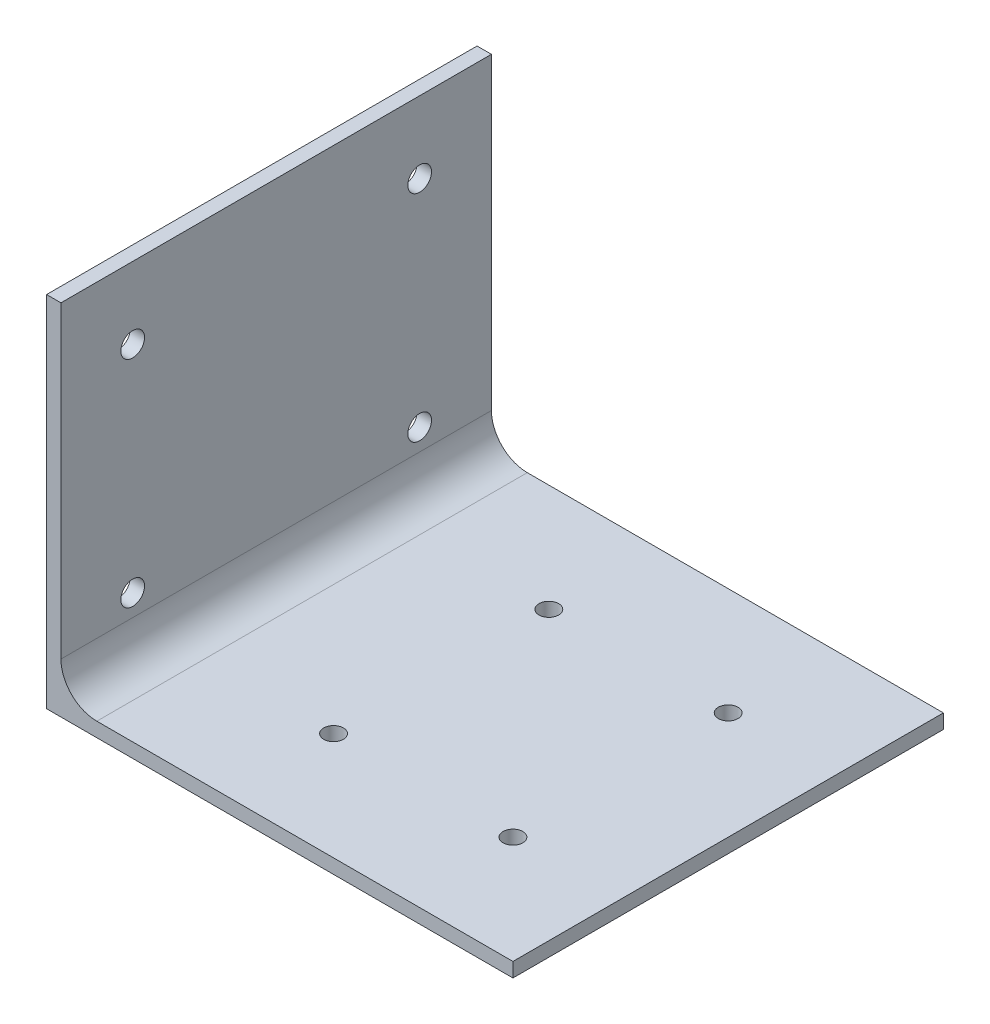
ISO-10303-21;
HEADER;
FILE_DESCRIPTION(('STEP AP214'),'2;1');
FILE_NAME('part.step','',(''),(''),'','','');
FILE_SCHEMA(('AUTOMOTIVE_DESIGN { 1 0 10303 214 1 1 1 1 }'));
ENDSEC;
DATA;
#1=APPLICATION_CONTEXT('core data for automotive mechanical design processes');
#2=APPLICATION_PROTOCOL_DEFINITION('international standard','automotive_design',2000,#1);
#3=PRODUCT_CONTEXT('',#1,'mechanical');
#4=PRODUCT('Part','Part','',(#3));
#5=PRODUCT_RELATED_PRODUCT_CATEGORY('part','',(#4));
#6=PRODUCT_DEFINITION_FORMATION('','',#4);
#7=PRODUCT_DEFINITION_CONTEXT('part definition',#1,'design');
#8=PRODUCT_DEFINITION('design','',#6,#7);
#9=PRODUCT_DEFINITION_SHAPE('','',#8);
#10=(LENGTH_UNIT() NAMED_UNIT(*) SI_UNIT(.MILLI.,.METRE.));
#11=(NAMED_UNIT(*) PLANE_ANGLE_UNIT() SI_UNIT($,.RADIAN.));
#12=(NAMED_UNIT(*) SI_UNIT($,.STERADIAN.) SOLID_ANGLE_UNIT());
#13=UNCERTAINTY_MEASURE_WITH_UNIT(LENGTH_MEASURE(1.E-05),#10,'distance_accuracy_value','');
#14=(GEOMETRIC_REPRESENTATION_CONTEXT(3) GLOBAL_UNCERTAINTY_ASSIGNED_CONTEXT((#13)) GLOBAL_UNIT_ASSIGNED_CONTEXT((#10,
#11,#12)) REPRESENTATION_CONTEXT('',''));
#15=CARTESIAN_POINT('',(0.,0.,0.));
#16=DIRECTION('',(0.,0.,1.));
#17=DIRECTION('',(1.,0.,0.));
#18=AXIS2_PLACEMENT_3D('',#15,#16,#17);
#19=CARTESIAN_POINT('',(130.,0.,120.));
#20=DIRECTION('',(0.,1.,0.));
#21=DIRECTION('',(-1.,0.,0.));
#22=AXIS2_PLACEMENT_3D('',#19,#20,#21);
#23=PLANE('',#22);
#24=CARTESIAN_POINT('',(100.,0.,90.));
#25=DIRECTION('',(0.,1.,0.));
#26=DIRECTION('',(-1.,0.,0.));
#27=AXIS2_PLACEMENT_3D('',#24,#25,#26);
#28=CIRCLE('',#27,2.75000000000001);
#29=CARTESIAN_POINT('',(97.25,0.,90.));
#30=VERTEX_POINT('',#29);
#31=EDGE_CURVE('E181',#30,#30,#28,.T.);
#32=ORIENTED_EDGE('',*,*,#31,.T.);
#33=EDGE_LOOP('',(#32));
#34=FACE_BOUND('',#33,.T.);
#35=CARTESIAN_POINT('',(50.,0.,90.));
#36=DIRECTION('',(0.,1.,0.));
#37=DIRECTION('',(-1.,0.,0.));
#38=AXIS2_PLACEMENT_3D('',#35,#36,#37);
#39=CIRCLE('',#38,2.75);
#40=CARTESIAN_POINT('',(47.25,0.,90.));
#41=VERTEX_POINT('',#40);
#42=EDGE_CURVE('E190',#41,#41,#39,.T.);
#43=ORIENTED_EDGE('',*,*,#42,.T.);
#44=EDGE_LOOP('',(#43));
#45=FACE_BOUND('',#44,.T.);
#46=CARTESIAN_POINT('',(50.,0.,30.));
#47=DIRECTION('',(0.,1.,0.));
#48=DIRECTION('',(-1.,0.,0.));
#49=AXIS2_PLACEMENT_3D('',#46,#47,#48);
#50=CIRCLE('',#49,2.75);
#51=CARTESIAN_POINT('',(47.25,0.,30.));
#52=VERTEX_POINT('',#51);
#53=EDGE_CURVE('E193',#52,#52,#50,.T.);
#54=ORIENTED_EDGE('',*,*,#53,.T.);
#55=EDGE_LOOP('',(#54));
#56=FACE_BOUND('',#55,.T.);
#57=CARTESIAN_POINT('',(100.,0.,30.));
#58=DIRECTION('',(0.,1.,0.));
#59=DIRECTION('',(-1.,0.,0.));
#60=AXIS2_PLACEMENT_3D('',#57,#58,#59);
#61=CIRCLE('',#60,2.75000000000001);
#62=CARTESIAN_POINT('',(97.25,0.,30.));
#63=VERTEX_POINT('',#62);
#64=EDGE_CURVE('E162',#63,#63,#61,.T.);
#65=ORIENTED_EDGE('',*,*,#64,.T.);
#66=EDGE_LOOP('',(#65));
#67=FACE_BOUND('',#66,.T.);
#68=DIRECTION('',(1.,0.,0.));
#69=VECTOR('',#68,1.);
#70=CARTESIAN_POINT('',(130.,0.,0.));
#71=LINE('',#70,#69);
#72=CARTESIAN_POINT('',(0.,0.,0.));
#73=VERTEX_POINT('',#72);
#74=CARTESIAN_POINT('',(130.,0.,0.));
#75=VERTEX_POINT('',#74);
#76=EDGE_CURVE('E116',#73,#75,#71,.T.);
#77=ORIENTED_EDGE('',*,*,#76,.T.);
#78=DIRECTION('',(0.,0.,-1.));
#79=VECTOR('',#78,1.);
#80=CARTESIAN_POINT('',(130.,0.,120.));
#81=LINE('',#80,#79);
#82=CARTESIAN_POINT('',(130.,0.,120.));
#83=VERTEX_POINT('',#82);
#84=EDGE_CURVE('E105',#83,#75,#81,.T.);
#85=ORIENTED_EDGE('',*,*,#84,.F.);
#86=DIRECTION('',(1.,0.,0.));
#87=VECTOR('',#86,1.);
#88=CARTESIAN_POINT('',(130.,0.,120.));
#89=LINE('',#88,#87);
#90=CARTESIAN_POINT('',(0.,0.,120.));
#91=VERTEX_POINT('',#90);
#92=EDGE_CURVE('E107',#91,#83,#89,.T.);
#93=ORIENTED_EDGE('',*,*,#92,.F.);
#94=DIRECTION('',(0.,0.,-1.));
#95=VECTOR('',#94,1.);
#96=CARTESIAN_POINT('',(0.,0.,120.));
#97=LINE('',#96,#95);
#98=EDGE_CURVE('E135',#91,#73,#97,.T.);
#99=ORIENTED_EDGE('',*,*,#98,.T.);
#100=EDGE_LOOP('',(#77,#85,#93,#99));
#101=FACE_BOUND('',#100,.T.);
#102=ADVANCED_FACE('F39',(#34,#45,#56,#67,#101),#23,.F.);
#103=CARTESIAN_POINT('',(130.,4.,120.));
#104=DIRECTION('',(-1.,0.,0.));
#105=DIRECTION('',(0.,0.,1.));
#106=AXIS2_PLACEMENT_3D('',#103,#104,#105);
#107=PLANE('',#106);
#108=DIRECTION('',(0.,1.,0.));
#109=VECTOR('',#108,1.);
#110=CARTESIAN_POINT('',(130.,4.,0.));
#111=LINE('',#110,#109);
#112=CARTESIAN_POINT('',(130.,4.,0.));
#113=VERTEX_POINT('',#112);
#114=EDGE_CURVE('E141',#75,#113,#111,.T.);
#115=ORIENTED_EDGE('',*,*,#114,.T.);
#116=DIRECTION('',(0.,0.,-1.));
#117=VECTOR('',#116,1.);
#118=CARTESIAN_POINT('',(130.,4.,120.));
#119=LINE('',#118,#117);
#120=CARTESIAN_POINT('',(130.,4.,120.));
#121=VERTEX_POINT('',#120);
#122=EDGE_CURVE('E104',#121,#113,#119,.T.);
#123=ORIENTED_EDGE('',*,*,#122,.F.);
#124=DIRECTION('',(0.,1.,0.));
#125=VECTOR('',#124,1.);
#126=CARTESIAN_POINT('',(130.,4.,120.));
#127=LINE('',#126,#125);
#128=EDGE_CURVE('E98',#83,#121,#127,.T.);
#129=ORIENTED_EDGE('',*,*,#128,.F.);
#130=ORIENTED_EDGE('',*,*,#84,.T.);
#131=EDGE_LOOP('',(#115,#123,#129,#130));
#132=FACE_BOUND('',#131,.T.);
#133=ADVANCED_FACE('F99',(#132),#107,.F.);
#134=CARTESIAN_POINT('',(4.00000000000001,4.,120.));
#135=DIRECTION('',(0.,-1.,0.));
#136=DIRECTION('',(1.,0.,0.));
#137=AXIS2_PLACEMENT_3D('',#134,#135,#136);
#138=PLANE('',#137);
#139=CARTESIAN_POINT('',(100.,4.,90.));
#140=DIRECTION('',(0.,1.,0.));
#141=DIRECTION('',(-1.,0.,0.));
#142=AXIS2_PLACEMENT_3D('',#139,#140,#141);
#143=CIRCLE('',#142,2.75000000000001);
#144=CARTESIAN_POINT('',(97.25,4.,90.));
#145=VERTEX_POINT('',#144);
#146=EDGE_CURVE('E188',#145,#145,#143,.T.);
#147=ORIENTED_EDGE('',*,*,#146,.F.);
#148=EDGE_LOOP('',(#147));
#149=FACE_BOUND('',#148,.T.);
#150=CARTESIAN_POINT('',(50.,4.,90.));
#151=DIRECTION('',(0.,1.,0.));
#152=DIRECTION('',(-1.,0.,0.));
#153=AXIS2_PLACEMENT_3D('',#150,#151,#152);
#154=CIRCLE('',#153,2.75);
#155=CARTESIAN_POINT('',(47.25,4.,90.));
#156=VERTEX_POINT('',#155);
#157=EDGE_CURVE('E194',#156,#156,#154,.T.);
#158=ORIENTED_EDGE('',*,*,#157,.F.);
#159=EDGE_LOOP('',(#158));
#160=FACE_BOUND('',#159,.T.);
#161=CARTESIAN_POINT('',(50.,4.,30.));
#162=DIRECTION('',(0.,1.,0.));
#163=DIRECTION('',(-1.,0.,0.));
#164=AXIS2_PLACEMENT_3D('',#161,#162,#163);
#165=CIRCLE('',#164,2.75);
#166=CARTESIAN_POINT('',(47.25,4.,30.));
#167=VERTEX_POINT('',#166);
#168=EDGE_CURVE('E178',#167,#167,#165,.T.);
#169=ORIENTED_EDGE('',*,*,#168,.F.);
#170=EDGE_LOOP('',(#169));
#171=FACE_BOUND('',#170,.T.);
#172=CARTESIAN_POINT('',(100.,4.,30.));
#173=DIRECTION('',(0.,1.,0.));
#174=DIRECTION('',(-1.,0.,0.));
#175=AXIS2_PLACEMENT_3D('',#172,#173,#174);
#176=CIRCLE('',#175,2.75000000000001);
#177=CARTESIAN_POINT('',(97.25,4.,30.));
#178=VERTEX_POINT('',#177);
#179=EDGE_CURVE('E179',#178,#178,#176,.T.);
#180=ORIENTED_EDGE('',*,*,#179,.F.);
#181=EDGE_LOOP('',(#180));
#182=FACE_BOUND('',#181,.T.);
#183=DIRECTION('',(-1.,0.,0.));
#184=VECTOR('',#183,1.);
#185=CARTESIAN_POINT('',(4.00000000000001,4.,0.));
#186=LINE('',#185,#184);
#187=CARTESIAN_POINT('',(14.,4.,0.));
#188=VERTEX_POINT('',#187);
#189=EDGE_CURVE('E143',#113,#188,#186,.T.);
#190=ORIENTED_EDGE('',*,*,#189,.T.);
#191=DIRECTION('',(0.,0.,-1.));
#192=VECTOR('',#191,1.);
#193=CARTESIAN_POINT('',(14.,4.,120.));
#194=LINE('',#193,#192);
#195=CARTESIAN_POINT('',(14.,4.,120.));
#196=VERTEX_POINT('',#195);
#197=EDGE_CURVE('E53',#188,#196,#194,.F.);
#198=ORIENTED_EDGE('',*,*,#197,.T.);
#199=DIRECTION('',(-1.,0.,0.));
#200=VECTOR('',#199,1.);
#201=CARTESIAN_POINT('',(4.00000000000001,4.,120.));
#202=LINE('',#201,#200);
#203=EDGE_CURVE('E110',#121,#196,#202,.T.);
#204=ORIENTED_EDGE('',*,*,#203,.F.);
#205=ORIENTED_EDGE('',*,*,#122,.T.);
#206=EDGE_LOOP('',(#190,#198,#204,#205));
#207=FACE_BOUND('',#206,.T.);
#208=ADVANCED_FACE('F201',(#149,#160,#171,#182,#207),#138,.F.);
#209=CARTESIAN_POINT('',(4.,100.,120.));
#210=DIRECTION('',(-1.,0.,0.));
#211=DIRECTION('',(0.,-1.,0.));
#212=AXIS2_PLACEMENT_3D('',#209,#210,#211);
#213=PLANE('',#212);
#214=CARTESIAN_POINT('',(4.00000000000001,20.,100.));
#215=DIRECTION('',(1.,0.,0.));
#216=DIRECTION('',(0.,1.,0.));
#217=AXIS2_PLACEMENT_3D('',#214,#215,#216);
#218=CIRCLE('',#217,3.30000000000001);
#219=CARTESIAN_POINT('',(4.00000000000001,23.3,100.));
#220=VERTEX_POINT('',#219);
#221=EDGE_CURVE('E165',#220,#220,#218,.T.);
#222=ORIENTED_EDGE('',*,*,#221,.F.);
#223=EDGE_LOOP('',(#222));
#224=FACE_BOUND('',#223,.T.);
#225=CARTESIAN_POINT('',(4.00000000000001,20.,20.));
#226=DIRECTION('',(1.,0.,0.));
#227=DIRECTION('',(0.,1.,0.));
#228=AXIS2_PLACEMENT_3D('',#225,#226,#227);
#229=CIRCLE('',#228,3.3);
#230=CARTESIAN_POINT('',(4.00000000000001,23.3,20.));
#231=VERTEX_POINT('',#230);
#232=EDGE_CURVE('E166',#231,#231,#229,.T.);
#233=ORIENTED_EDGE('',*,*,#232,.F.);
#234=EDGE_LOOP('',(#233));
#235=FACE_BOUND('',#234,.T.);
#236=CARTESIAN_POINT('',(4.,80.,20.));
#237=DIRECTION('',(1.,0.,0.));
#238=DIRECTION('',(0.,1.,0.));
#239=AXIS2_PLACEMENT_3D('',#236,#237,#238);
#240=CIRCLE('',#239,3.3);
#241=CARTESIAN_POINT('',(4.,83.3,20.));
#242=VERTEX_POINT('',#241);
#243=EDGE_CURVE('E156',#242,#242,#240,.T.);
#244=ORIENTED_EDGE('',*,*,#243,.F.);
#245=EDGE_LOOP('',(#244));
#246=FACE_BOUND('',#245,.T.);
#247=CARTESIAN_POINT('',(4.,80.,100.));
#248=DIRECTION('',(1.,0.,0.));
#249=DIRECTION('',(0.,1.,0.));
#250=AXIS2_PLACEMENT_3D('',#247,#248,#249);
#251=CIRCLE('',#250,3.3);
#252=CARTESIAN_POINT('',(4.,83.3,100.));
#253=VERTEX_POINT('',#252);
#254=EDGE_CURVE('E153',#253,#253,#251,.T.);
#255=ORIENTED_EDGE('',*,*,#254,.F.);
#256=EDGE_LOOP('',(#255));
#257=FACE_BOUND('',#256,.T.);
#258=DIRECTION('',(0.,1.,0.));
#259=VECTOR('',#258,1.);
#260=CARTESIAN_POINT('',(4.,100.,120.));
#261=LINE('',#260,#259);
#262=CARTESIAN_POINT('',(4.00000000000001,14.,120.));
#263=VERTEX_POINT('',#262);
#264=CARTESIAN_POINT('',(4.,100.,120.));
#265=VERTEX_POINT('',#264);
#266=EDGE_CURVE('E147',#263,#265,#261,.T.);
#267=ORIENTED_EDGE('',*,*,#266,.F.);
#268=DIRECTION('',(0.,0.,-1.));
#269=VECTOR('',#268,1.);
#270=CARTESIAN_POINT('',(4.00000000000001,14.,0.));
#271=LINE('',#270,#269);
#272=CARTESIAN_POINT('',(4.00000000000001,14.,0.));
#273=VERTEX_POINT('',#272);
#274=EDGE_CURVE('E122',#263,#273,#271,.T.);
#275=ORIENTED_EDGE('',*,*,#274,.T.);
#276=DIRECTION('',(0.,1.,0.));
#277=VECTOR('',#276,1.);
#278=CARTESIAN_POINT('',(4.,100.,0.));
#279=LINE('',#278,#277);
#280=CARTESIAN_POINT('',(4.,100.,0.));
#281=VERTEX_POINT('',#280);
#282=EDGE_CURVE('E136',#273,#281,#279,.T.);
#283=ORIENTED_EDGE('',*,*,#282,.T.);
#284=DIRECTION('',(0.,0.,-1.));
#285=VECTOR('',#284,1.);
#286=CARTESIAN_POINT('',(4.,100.,120.));
#287=LINE('',#286,#285);
#288=EDGE_CURVE('E123',#265,#281,#287,.T.);
#289=ORIENTED_EDGE('',*,*,#288,.F.);
#290=EDGE_LOOP('',(#267,#275,#283,#289));
#291=FACE_BOUND('',#290,.T.);
#292=ADVANCED_FACE('F206',(#224,#235,#246,#257,#291),#213,.F.);
#293=CARTESIAN_POINT('',(0.,100.,120.));
#294=DIRECTION('',(0.,-1.,0.));
#295=DIRECTION('',(0.,0.,-1.));
#296=AXIS2_PLACEMENT_3D('',#293,#294,#295);
#297=PLANE('',#296);
#298=DIRECTION('',(-1.,0.,0.));
#299=VECTOR('',#298,1.);
#300=CARTESIAN_POINT('',(0.,100.,0.));
#301=LINE('',#300,#299);
#302=CARTESIAN_POINT('',(0.,100.,0.));
#303=VERTEX_POINT('',#302);
#304=EDGE_CURVE('E139',#281,#303,#301,.T.);
#305=ORIENTED_EDGE('',*,*,#304,.T.);
#306=DIRECTION('',(0.,0.,-1.));
#307=VECTOR('',#306,1.);
#308=CARTESIAN_POINT('',(0.,100.,120.));
#309=LINE('',#308,#307);
#310=CARTESIAN_POINT('',(0.,100.,120.));
#311=VERTEX_POINT('',#310);
#312=EDGE_CURVE('E133',#311,#303,#309,.T.);
#313=ORIENTED_EDGE('',*,*,#312,.F.);
#314=DIRECTION('',(-1.,0.,0.));
#315=VECTOR('',#314,1.);
#316=CARTESIAN_POINT('',(0.,100.,120.));
#317=LINE('',#316,#315);
#318=EDGE_CURVE('E146',#265,#311,#317,.T.);
#319=ORIENTED_EDGE('',*,*,#318,.F.);
#320=ORIENTED_EDGE('',*,*,#288,.T.);
#321=EDGE_LOOP('',(#305,#313,#319,#320));
#322=FACE_BOUND('',#321,.T.);
#323=ADVANCED_FACE('F219',(#322),#297,.F.);
#324=CARTESIAN_POINT('',(0.,0.,120.));
#325=DIRECTION('',(1.,0.,0.));
#326=DIRECTION('',(0.,0.,-1.));
#327=AXIS2_PLACEMENT_3D('',#324,#325,#326);
#328=PLANE('',#327);
#329=CARTESIAN_POINT('',(0.,20.,100.));
#330=DIRECTION('',(1.,0.,0.));
#331=DIRECTION('',(0.,1.,0.));
#332=AXIS2_PLACEMENT_3D('',#329,#330,#331);
#333=CIRCLE('',#332,3.30000000000001);
#334=CARTESIAN_POINT('',(0.,23.3,100.));
#335=VERTEX_POINT('',#334);
#336=EDGE_CURVE('E157',#335,#335,#333,.T.);
#337=ORIENTED_EDGE('',*,*,#336,.T.);
#338=EDGE_LOOP('',(#337));
#339=FACE_BOUND('',#338,.T.);
#340=CARTESIAN_POINT('',(0.,20.,20.));
#341=DIRECTION('',(1.,0.,0.));
#342=DIRECTION('',(0.,1.,0.));
#343=AXIS2_PLACEMENT_3D('',#340,#341,#342);
#344=CIRCLE('',#343,3.3);
#345=CARTESIAN_POINT('',(0.,23.3,20.));
#346=VERTEX_POINT('',#345);
#347=EDGE_CURVE('E167',#346,#346,#344,.T.);
#348=ORIENTED_EDGE('',*,*,#347,.T.);
#349=EDGE_LOOP('',(#348));
#350=FACE_BOUND('',#349,.T.);
#351=CARTESIAN_POINT('',(0.,80.,20.));
#352=DIRECTION('',(1.,0.,0.));
#353=DIRECTION('',(0.,1.,0.));
#354=AXIS2_PLACEMENT_3D('',#351,#352,#353);
#355=CIRCLE('',#354,3.3);
#356=CARTESIAN_POINT('',(0.,83.3,20.));
#357=VERTEX_POINT('',#356);
#358=EDGE_CURVE('E174',#357,#357,#355,.T.);
#359=ORIENTED_EDGE('',*,*,#358,.T.);
#360=EDGE_LOOP('',(#359));
#361=FACE_BOUND('',#360,.T.);
#362=CARTESIAN_POINT('',(0.,80.,100.));
#363=DIRECTION('',(1.,0.,0.));
#364=DIRECTION('',(0.,1.,0.));
#365=AXIS2_PLACEMENT_3D('',#362,#363,#364);
#366=CIRCLE('',#365,3.3);
#367=CARTESIAN_POINT('',(0.,83.3,100.));
#368=VERTEX_POINT('',#367);
#369=EDGE_CURVE('E148',#368,#368,#366,.T.);
#370=ORIENTED_EDGE('',*,*,#369,.T.);
#371=EDGE_LOOP('',(#370));
#372=FACE_BOUND('',#371,.T.);
#373=DIRECTION('',(0.,-1.,0.));
#374=VECTOR('',#373,1.);
#375=CARTESIAN_POINT('',(0.,0.,0.));
#376=LINE('',#375,#374);
#377=EDGE_CURVE('E119',#303,#73,#376,.T.);
#378=ORIENTED_EDGE('',*,*,#377,.T.);
#379=ORIENTED_EDGE('',*,*,#98,.F.);
#380=DIRECTION('',(0.,-1.,0.));
#381=VECTOR('',#380,1.);
#382=CARTESIAN_POINT('',(0.,0.,120.));
#383=LINE('',#382,#381);
#384=EDGE_CURVE('E114',#311,#91,#383,.T.);
#385=ORIENTED_EDGE('',*,*,#384,.F.);
#386=ORIENTED_EDGE('',*,*,#312,.T.);
#387=EDGE_LOOP('',(#378,#379,#385,#386));
#388=FACE_BOUND('',#387,.T.);
#389=ADVANCED_FACE('F224',(#339,#350,#361,#372,#388),#328,.F.);
#390=CARTESIAN_POINT('',(0.,0.,120.));
#391=DIRECTION('',(0.,0.,-1.));
#392=DIRECTION('',(-1.,0.,0.));
#393=AXIS2_PLACEMENT_3D('',#390,#391,#392);
#394=PLANE('',#393);
#395=ORIENTED_EDGE('',*,*,#92,.T.);
#396=ORIENTED_EDGE('',*,*,#128,.T.);
#397=ORIENTED_EDGE('',*,*,#203,.T.);
#398=CARTESIAN_POINT('',(14.,14.,120.));
#399=DIRECTION('',(0.,0.,-1.));
#400=DIRECTION('',(-1.,0.,0.));
#401=AXIS2_PLACEMENT_3D('',#398,#399,#400);
#402=CIRCLE('',#401,10.);
#403=EDGE_CURVE('E11',#196,#263,#402,.T.);
#404=ORIENTED_EDGE('',*,*,#403,.T.);
#405=ORIENTED_EDGE('',*,*,#266,.T.);
#406=ORIENTED_EDGE('',*,*,#318,.T.);
#407=ORIENTED_EDGE('',*,*,#384,.T.);
#408=EDGE_LOOP('',(#395,#396,#397,#404,#405,#406,#407));
#409=FACE_BOUND('',#408,.T.);
#410=ADVANCED_FACE('F112',(#409),#394,.F.);
#411=CARTESIAN_POINT('',(0.,0.,0.));
#412=DIRECTION('',(0.,0.,-1.));
#413=DIRECTION('',(-1.,0.,0.));
#414=AXIS2_PLACEMENT_3D('',#411,#412,#413);
#415=PLANE('',#414);
#416=ORIENTED_EDGE('',*,*,#76,.F.);
#417=ORIENTED_EDGE('',*,*,#377,.F.);
#418=ORIENTED_EDGE('',*,*,#304,.F.);
#419=ORIENTED_EDGE('',*,*,#282,.F.);
#420=CARTESIAN_POINT('',(14.,14.,0.));
#421=DIRECTION('',(0.,0.,-1.));
#422=DIRECTION('',(-1.,0.,0.));
#423=AXIS2_PLACEMENT_3D('',#420,#421,#422);
#424=CIRCLE('',#423,10.);
#425=EDGE_CURVE('E50',#273,#188,#424,.F.);
#426=ORIENTED_EDGE('',*,*,#425,.T.);
#427=ORIENTED_EDGE('',*,*,#189,.F.);
#428=ORIENTED_EDGE('',*,*,#114,.F.);
#429=EDGE_LOOP('',(#416,#417,#418,#419,#426,#427,#428));
#430=FACE_BOUND('',#429,.T.);
#431=ADVANCED_FACE('F221',(#430),#415,.T.);
#432=CARTESIAN_POINT('',(0.,80.,100.));
#433=DIRECTION('',(1.,0.,0.));
#434=DIRECTION('',(0.,1.,0.));
#435=AXIS2_PLACEMENT_3D('',#432,#433,#434);
#436=CYLINDRICAL_SURFACE('',#435,3.3);
#437=ORIENTED_EDGE('',*,*,#369,.F.);
#438=EDGE_LOOP('',(#437));
#439=FACE_BOUND('',#438,.T.);
#440=ORIENTED_EDGE('',*,*,#254,.T.);
#441=EDGE_LOOP('',(#440));
#442=FACE_BOUND('',#441,.T.);
#443=ADVANCED_FACE('F228',(#439,#442),#436,.F.);
#444=CARTESIAN_POINT('',(0.,80.,20.));
#445=DIRECTION('',(1.,0.,0.));
#446=DIRECTION('',(0.,1.,0.));
#447=AXIS2_PLACEMENT_3D('',#444,#445,#446);
#448=CYLINDRICAL_SURFACE('',#447,3.3);
#449=ORIENTED_EDGE('',*,*,#358,.F.);
#450=EDGE_LOOP('',(#449));
#451=FACE_BOUND('',#450,.T.);
#452=ORIENTED_EDGE('',*,*,#243,.T.);
#453=EDGE_LOOP('',(#452));
#454=FACE_BOUND('',#453,.T.);
#455=ADVANCED_FACE('F235',(#451,#454),#448,.F.);
#456=CARTESIAN_POINT('',(0.,20.,20.));
#457=DIRECTION('',(1.,0.,0.));
#458=DIRECTION('',(0.,1.,0.));
#459=AXIS2_PLACEMENT_3D('',#456,#457,#458);
#460=CYLINDRICAL_SURFACE('',#459,3.3);
#461=ORIENTED_EDGE('',*,*,#347,.F.);
#462=EDGE_LOOP('',(#461));
#463=FACE_BOUND('',#462,.T.);
#464=ORIENTED_EDGE('',*,*,#232,.T.);
#465=EDGE_LOOP('',(#464));
#466=FACE_BOUND('',#465,.T.);
#467=ADVANCED_FACE('F267',(#463,#466),#460,.F.);
#468=CARTESIAN_POINT('',(0.,20.,100.));
#469=DIRECTION('',(1.,0.,0.));
#470=DIRECTION('',(0.,1.,0.));
#471=AXIS2_PLACEMENT_3D('',#468,#469,#470);
#472=CYLINDRICAL_SURFACE('',#471,3.30000000000001);
#473=ORIENTED_EDGE('',*,*,#336,.F.);
#474=EDGE_LOOP('',(#473));
#475=FACE_BOUND('',#474,.T.);
#476=ORIENTED_EDGE('',*,*,#221,.T.);
#477=EDGE_LOOP('',(#476));
#478=FACE_BOUND('',#477,.T.);
#479=ADVANCED_FACE('F277',(#475,#478),#472,.F.);
#480=CARTESIAN_POINT('',(100.,0.,30.));
#481=DIRECTION('',(0.,1.,0.));
#482=DIRECTION('',(-1.,0.,0.));
#483=AXIS2_PLACEMENT_3D('',#480,#481,#482);
#484=CYLINDRICAL_SURFACE('',#483,2.75000000000001);
#485=ORIENTED_EDGE('',*,*,#64,.F.);
#486=EDGE_LOOP('',(#485));
#487=FACE_BOUND('',#486,.T.);
#488=ORIENTED_EDGE('',*,*,#179,.T.);
#489=EDGE_LOOP('',(#488));
#490=FACE_BOUND('',#489,.T.);
#491=ADVANCED_FACE('F278',(#487,#490),#484,.F.);
#492=CARTESIAN_POINT('',(50.,0.,30.));
#493=DIRECTION('',(0.,1.,0.));
#494=DIRECTION('',(-1.,0.,0.));
#495=AXIS2_PLACEMENT_3D('',#492,#493,#494);
#496=CYLINDRICAL_SURFACE('',#495,2.75);
#497=ORIENTED_EDGE('',*,*,#53,.F.);
#498=EDGE_LOOP('',(#497));
#499=FACE_BOUND('',#498,.T.);
#500=ORIENTED_EDGE('',*,*,#168,.T.);
#501=EDGE_LOOP('',(#500));
#502=FACE_BOUND('',#501,.T.);
#503=ADVANCED_FACE('F203',(#499,#502),#496,.F.);
#504=CARTESIAN_POINT('',(50.,0.,90.));
#505=DIRECTION('',(0.,1.,0.));
#506=DIRECTION('',(-1.,0.,0.));
#507=AXIS2_PLACEMENT_3D('',#504,#505,#506);
#508=CYLINDRICAL_SURFACE('',#507,2.75);
#509=ORIENTED_EDGE('',*,*,#42,.F.);
#510=EDGE_LOOP('',(#509));
#511=FACE_BOUND('',#510,.T.);
#512=ORIENTED_EDGE('',*,*,#157,.T.);
#513=EDGE_LOOP('',(#512));
#514=FACE_BOUND('',#513,.T.);
#515=ADVANCED_FACE('F293',(#511,#514),#508,.F.);
#516=CARTESIAN_POINT('',(100.,0.,90.));
#517=DIRECTION('',(0.,1.,0.));
#518=DIRECTION('',(-1.,0.,0.));
#519=AXIS2_PLACEMENT_3D('',#516,#517,#518);
#520=CYLINDRICAL_SURFACE('',#519,2.75000000000001);
#521=ORIENTED_EDGE('',*,*,#31,.F.);
#522=EDGE_LOOP('',(#521));
#523=FACE_BOUND('',#522,.T.);
#524=ORIENTED_EDGE('',*,*,#146,.T.);
#525=EDGE_LOOP('',(#524));
#526=FACE_BOUND('',#525,.T.);
#527=ADVANCED_FACE('F301',(#523,#526),#520,.F.);
#528=CARTESIAN_POINT('',(14.,14.,120.));
#529=DIRECTION('',(0.,0.,1.));
#530=DIRECTION('',(1.,0.,0.));
#531=AXIS2_PLACEMENT_3D('',#528,#529,#530);
#532=CYLINDRICAL_SURFACE('',#531,10.);
#533=ORIENTED_EDGE('',*,*,#403,.F.);
#534=ORIENTED_EDGE('',*,*,#197,.F.);
#535=ORIENTED_EDGE('',*,*,#425,.F.);
#536=ORIENTED_EDGE('',*,*,#274,.F.);
#537=EDGE_LOOP('',(#533,#534,#535,#536));
#538=FACE_BOUND('',#537,.T.);
#539=ADVANCED_FACE('F41',(#538),#532,.F.);
#540=CLOSED_SHELL('',(#102,#133,#208,#292,#323,#389,#410,#431,#443,#455,#467,#479,#491,#503,
#515,#527,#539));
#541=MANIFOLD_SOLID_BREP('B2',#540);
#542=ADVANCED_BREP_SHAPE_REPRESENTATION('',(#18,#541),#14);
#543=SHAPE_DEFINITION_REPRESENTATION(#9,#542);
ENDSEC;
END-ISO-10303-21;
